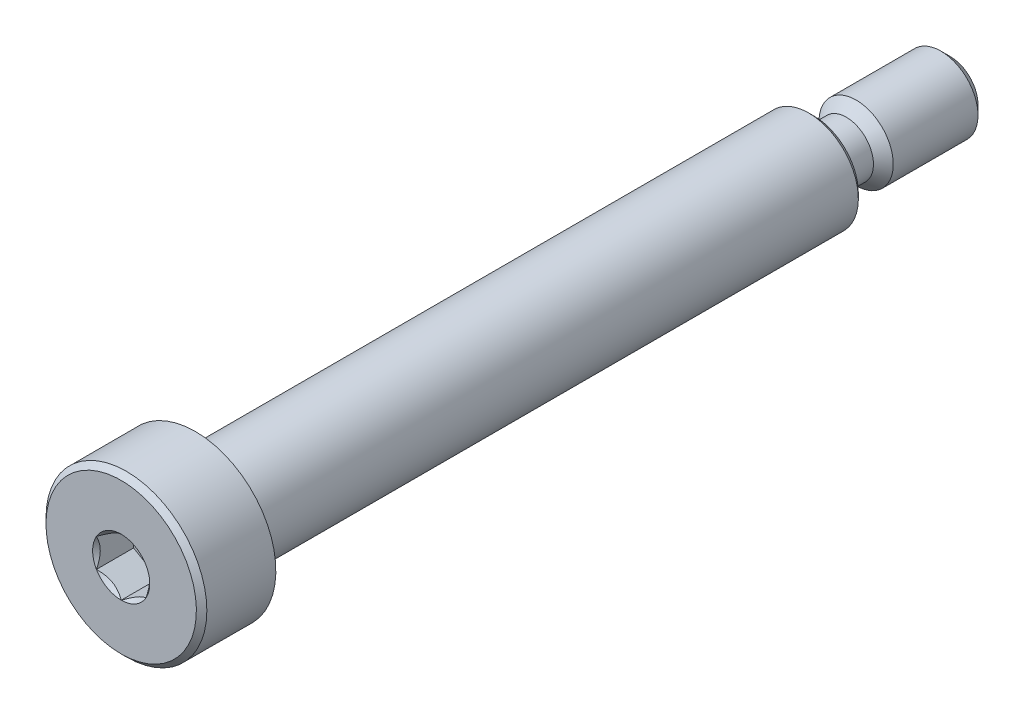
ISO-10303-21;
HEADER;
FILE_DESCRIPTION(('STEP AP214'),'2;1');
FILE_NAME('part.step','',(''),(''),'','','');
FILE_SCHEMA(('AUTOMOTIVE_DESIGN { 1 0 10303 214 1 1 1 1 }'));
ENDSEC;
DATA;
#1=APPLICATION_CONTEXT('core data for automotive mechanical design processes');
#2=APPLICATION_PROTOCOL_DEFINITION('international standard','automotive_design',2000,#1);
#3=PRODUCT_CONTEXT('',#1,'mechanical');
#4=PRODUCT('Part','Part','',(#3));
#5=PRODUCT_RELATED_PRODUCT_CATEGORY('part','',(#4));
#6=PRODUCT_DEFINITION_FORMATION('','',#4);
#7=PRODUCT_DEFINITION_CONTEXT('part definition',#1,'design');
#8=PRODUCT_DEFINITION('design','',#6,#7);
#9=PRODUCT_DEFINITION_SHAPE('','',#8);
#10=(LENGTH_UNIT() NAMED_UNIT(*) SI_UNIT(.MILLI.,.METRE.));
#11=(NAMED_UNIT(*) PLANE_ANGLE_UNIT() SI_UNIT($,.RADIAN.));
#12=(NAMED_UNIT(*) SI_UNIT($,.STERADIAN.) SOLID_ANGLE_UNIT());
#13=UNCERTAINTY_MEASURE_WITH_UNIT(LENGTH_MEASURE(1.E-05),#10,'distance_accuracy_value','');
#14=(GEOMETRIC_REPRESENTATION_CONTEXT(3) GLOBAL_UNCERTAINTY_ASSIGNED_CONTEXT((#13)) GLOBAL_UNIT_ASSIGNED_CONTEXT((#10,
#11,#12)) REPRESENTATION_CONTEXT('',''));
#15=CARTESIAN_POINT('',(0.,0.,0.));
#16=DIRECTION('',(0.,0.,1.));
#17=DIRECTION('',(1.,0.,0.));
#18=AXIS2_PLACEMENT_3D('',#15,#16,#17);
#19=CARTESIAN_POINT('',(0.,0.,-67.));
#20=DIRECTION('',(0.,0.,-1.));
#21=DIRECTION('',(0.,1.,0.));
#22=AXIS2_PLACEMENT_3D('',#19,#20,#21);
#23=CYLINDRICAL_SURFACE('',#22,4.);
#24=CARTESIAN_POINT('',(0.,0.,-55.5775));
#25=DIRECTION('',(0.,0.,-1.));
#26=DIRECTION('',(0.,1.,0.));
#27=AXIS2_PLACEMENT_3D('',#24,#25,#26);
#28=CIRCLE('',#27,4.);
#29=CARTESIAN_POINT('',(0.,4.,-55.5775));
#30=VERTEX_POINT('',#29);
#31=EDGE_CURVE('E257',#30,#30,#28,.F.);
#32=ORIENTED_EDGE('',*,*,#31,.T.);
#33=EDGE_LOOP('',(#32));
#34=FACE_BOUND('',#33,.T.);
#35=CARTESIAN_POINT('',(0.,0.,-7.12666666666668));
#36=DIRECTION('',(0.,0.,-1.));
#37=DIRECTION('',(0.,1.,0.));
#38=AXIS2_PLACEMENT_3D('',#35,#36,#37);
#39=CIRCLE('',#38,4.);
#40=CARTESIAN_POINT('',(0.,4.,-7.12666666666668));
#41=VERTEX_POINT('',#40);
#42=EDGE_CURVE('E285',#41,#41,#39,.T.);
#43=ORIENTED_EDGE('',*,*,#42,.T.);
#44=EDGE_LOOP('',(#43));
#45=FACE_BOUND('',#44,.T.);
#46=ADVANCED_FACE('F41',(#34,#45),#23,.T.);
#47=CARTESIAN_POINT('',(0.,-4.,-56.));
#48=DIRECTION('',(0.,0.,-1.));
#49=DIRECTION('',(0.,1.,0.));
#50=AXIS2_PLACEMENT_3D('',#47,#48,#49);
#51=PLANE('',#50);
#52=CARTESIAN_POINT('',(0.,0.,-56.));
#53=DIRECTION('',(0.,0.,-1.));
#54=DIRECTION('',(0.,1.,0.));
#55=AXIS2_PLACEMENT_3D('',#52,#53,#54);
#56=CIRCLE('',#55,3.5775);
#57=CARTESIAN_POINT('',(0.,3.5775,-56.));
#58=VERTEX_POINT('',#57);
#59=EDGE_CURVE('E260',#58,#58,#56,.T.);
#60=ORIENTED_EDGE('',*,*,#59,.T.);
#61=EDGE_LOOP('',(#60));
#62=FACE_BOUND('',#61,.T.);
#63=CARTESIAN_POINT('',(0.,0.,-56.));
#64=DIRECTION('',(0.,0.,-1.));
#65=DIRECTION('',(0.,1.,0.));
#66=AXIS2_PLACEMENT_3D('',#63,#64,#65);
#67=CIRCLE('',#66,3.00000000000002);
#68=CARTESIAN_POINT('',(0.,3.00000000000002,-56.));
#69=VERTEX_POINT('',#68);
#70=EDGE_CURVE('E311',#69,#69,#67,.T.);
#71=ORIENTED_EDGE('',*,*,#70,.F.);
#72=EDGE_LOOP('',(#71));
#73=FACE_BOUND('',#72,.T.);
#74=ADVANCED_FACE('F211',(#62,#73),#51,.T.);
#75=CARTESIAN_POINT('',(0.,0.,-67.));
#76=DIRECTION('',(0.,0.,-1.));
#77=DIRECTION('',(0.,1.,0.));
#78=AXIS2_PLACEMENT_3D('',#75,#76,#77);
#79=CYLINDRICAL_SURFACE('',#78,3.13333333333333);
#80=CARTESIAN_POINT('',(0.,0.,-6.60666666666667));
#81=DIRECTION('',(0.,0.,-1.));
#82=DIRECTION('',(0.,1.,0.));
#83=AXIS2_PLACEMENT_3D('',#80,#81,#82);
#84=CIRCLE('',#83,3.13333333333333);
#85=CARTESIAN_POINT('',(0.,3.13333333333333,-6.60666666666667));
#86=VERTEX_POINT('',#85);
#87=EDGE_CURVE('E305',#86,#86,#84,.F.);
#88=ORIENTED_EDGE('',*,*,#87,.T.);
#89=EDGE_LOOP('',(#88));
#90=FACE_BOUND('',#89,.T.);
#91=CARTESIAN_POINT('',(0.,0.,-6.));
#92=DIRECTION('',(0.,0.,-1.));
#93=DIRECTION('',(0.,1.,0.));
#94=AXIS2_PLACEMENT_3D('',#91,#92,#93);
#95=CIRCLE('',#94,3.13333333333333);
#96=CARTESIAN_POINT('',(0.,3.13333333333333,-6.));
#97=VERTEX_POINT('',#96);
#98=EDGE_CURVE('E286',#97,#97,#95,.T.);
#99=ORIENTED_EDGE('',*,*,#98,.T.);
#100=EDGE_LOOP('',(#99));
#101=FACE_BOUND('',#100,.T.);
#102=ADVANCED_FACE('F217',(#90,#101),#79,.T.);
#103=CARTESIAN_POINT('',(0.,4.,-6.86666666666667));
#104=DIRECTION('',(0.,0.,-1.));
#105=DIRECTION('',(0.,1.,0.));
#106=AXIS2_PLACEMENT_3D('',#103,#104,#105);
#107=PLANE('',#106);
#108=CARTESIAN_POINT('',(0.,0.,-6.86666666666667));
#109=DIRECTION('',(0.,0.,-1.));
#110=DIRECTION('',(0.,1.,0.));
#111=AXIS2_PLACEMENT_3D('',#108,#109,#110);
#112=CIRCLE('',#111,3.73999999999998);
#113=CARTESIAN_POINT('',(0.,3.73999999999998,-6.86666666666667));
#114=VERTEX_POINT('',#113);
#115=EDGE_CURVE('E301',#114,#114,#112,.F.);
#116=ORIENTED_EDGE('',*,*,#115,.T.);
#117=EDGE_LOOP('',(#116));
#118=FACE_BOUND('',#117,.T.);
#119=CARTESIAN_POINT('',(0.,0.,-6.86666666666667));
#120=DIRECTION('',(0.,0.,-1.));
#121=DIRECTION('',(0.,1.,0.));
#122=AXIS2_PLACEMENT_3D('',#119,#120,#121);
#123=CIRCLE('',#122,3.39333333333333);
#124=CARTESIAN_POINT('',(0.,3.39333333333333,-6.86666666666667));
#125=VERTEX_POINT('',#124);
#126=EDGE_CURVE('E291',#125,#125,#123,.T.);
#127=ORIENTED_EDGE('',*,*,#126,.T.);
#128=EDGE_LOOP('',(#127));
#129=FACE_BOUND('',#128,.T.);
#130=ADVANCED_FACE('F235',(#118,#129),#107,.F.);
#131=CARTESIAN_POINT('',(0.,0.,0.));
#132=DIRECTION('',(0.,0.,1.));
#133=DIRECTION('',(0.,-1.,0.));
#134=AXIS2_PLACEMENT_3D('',#131,#132,#133);
#135=PLANE('',#134);
#136=CARTESIAN_POINT('',(0.,0.,0.));
#137=DIRECTION('',(0.,0.,1.));
#138=DIRECTION('',(1.,0.,0.));
#139=AXIS2_PLACEMENT_3D('',#136,#137,#138);
#140=CIRCLE('',#139,2.3094010767585);
#141=CARTESIAN_POINT('',(0.,-2.3094010767585,0.));
#142=VERTEX_POINT('',#141);
#143=CARTESIAN_POINT('',(2.,-1.15470053837925,0.));
#144=VERTEX_POINT('',#143);
#145=EDGE_CURVE('E62',#142,#144,#140,.T.);
#146=ORIENTED_EDGE('',*,*,#145,.F.);
#147=CARTESIAN_POINT('',(-2.,-1.15470053837925,0.));
#148=VERTEX_POINT('',#147);
#149=EDGE_CURVE('E69',#148,#142,#140,.T.);
#150=ORIENTED_EDGE('',*,*,#149,.F.);
#151=CARTESIAN_POINT('',(-2.,1.15470053837925,0.));
#152=VERTEX_POINT('',#151);
#153=EDGE_CURVE('E149',#152,#148,#140,.T.);
#154=ORIENTED_EDGE('',*,*,#153,.F.);
#155=CARTESIAN_POINT('',(0.,2.3094010767585,0.));
#156=VERTEX_POINT('',#155);
#157=EDGE_CURVE('E141',#156,#152,#140,.T.);
#158=ORIENTED_EDGE('',*,*,#157,.F.);
#159=CARTESIAN_POINT('',(2.,1.15470053837925,0.));
#160=VERTEX_POINT('',#159);
#161=EDGE_CURVE('E111',#160,#156,#140,.T.);
#162=ORIENTED_EDGE('',*,*,#161,.F.);
#163=EDGE_CURVE('E101',#144,#160,#140,.T.);
#164=ORIENTED_EDGE('',*,*,#163,.F.);
#165=EDGE_LOOP('',(#146,#150,#154,#158,#162,#164));
#166=FACE_BOUND('',#165,.T.);
#167=CARTESIAN_POINT('',(0.,0.,0.));
#168=DIRECTION('',(0.,0.,1.));
#169=DIRECTION('',(0.,-1.,0.));
#170=AXIS2_PLACEMENT_3D('',#167,#168,#169);
#171=CIRCLE('',#170,6.07749999999999);
#172=CARTESIAN_POINT('',(0.,-6.07749999999999,0.));
#173=VERTEX_POINT('',#172);
#174=EDGE_CURVE('E56',#173,#173,#171,.T.);
#175=ORIENTED_EDGE('',*,*,#174,.T.);
#176=EDGE_LOOP('',(#175));
#177=FACE_BOUND('',#176,.T.);
#178=ADVANCED_FACE('F138',(#166,#177),#135,.T.);
#179=CARTESIAN_POINT('',(0.,0.,-67.));
#180=DIRECTION('',(0.,0.,-1.));
#181=DIRECTION('',(0.,1.,0.));
#182=AXIS2_PLACEMENT_3D('',#179,#180,#181);
#183=CYLINDRICAL_SURFACE('',#182,6.49999999999999);
#184=CARTESIAN_POINT('',(0.,0.,-0.422499999999992));
#185=DIRECTION('',(0.,0.,1.));
#186=DIRECTION('',(0.,-1.,0.));
#187=AXIS2_PLACEMENT_3D('',#184,#185,#186);
#188=CIRCLE('',#187,6.49999999999999);
#189=CARTESIAN_POINT('',(0.,-6.49999999999999,-0.422499999999992));
#190=VERTEX_POINT('',#189);
#191=EDGE_CURVE('E266',#190,#190,#188,.F.);
#192=ORIENTED_EDGE('',*,*,#191,.T.);
#193=EDGE_LOOP('',(#192));
#194=FACE_BOUND('',#193,.T.);
#195=CARTESIAN_POINT('',(0.,0.,-6.));
#196=DIRECTION('',(0.,0.,-1.));
#197=DIRECTION('',(0.,1.,0.));
#198=AXIS2_PLACEMENT_3D('',#195,#196,#197);
#199=CIRCLE('',#198,6.49999999999999);
#200=CARTESIAN_POINT('',(0.,6.49999999999999,-6.));
#201=VERTEX_POINT('',#200);
#202=EDGE_CURVE('E283',#201,#201,#199,.T.);
#203=ORIENTED_EDGE('',*,*,#202,.F.);
#204=EDGE_LOOP('',(#203));
#205=FACE_BOUND('',#204,.T.);
#206=ADVANCED_FACE('F228',(#194,#205),#183,.T.);
#207=CARTESIAN_POINT('',(0.,-6.49999999999999,-6.));
#208=DIRECTION('',(0.,0.,-1.));
#209=DIRECTION('',(0.,1.,0.));
#210=AXIS2_PLACEMENT_3D('',#207,#208,#209);
#211=PLANE('',#210);
#212=ORIENTED_EDGE('',*,*,#202,.T.);
#213=EDGE_LOOP('',(#212));
#214=FACE_BOUND('',#213,.T.);
#215=ORIENTED_EDGE('',*,*,#98,.F.);
#216=EDGE_LOOP('',(#215));
#217=FACE_BOUND('',#216,.T.);
#218=ADVANCED_FACE('F224',(#214,#217),#211,.T.);
#219=CARTESIAN_POINT('',(0.,0.,-7.12666666666668));
#220=DIRECTION('',(0.,0.,-1.));
#221=DIRECTION('',(0.,1.,0.));
#222=AXIS2_PLACEMENT_3D('',#219,#220,#221);
#223=CONICAL_SURFACE('',#222,4.,0.78539816339745);
#224=ORIENTED_EDGE('',*,*,#115,.F.);
#225=EDGE_LOOP('',(#224));
#226=FACE_BOUND('',#225,.T.);
#227=ORIENTED_EDGE('',*,*,#42,.F.);
#228=EDGE_LOOP('',(#227));
#229=FACE_BOUND('',#228,.T.);
#230=ADVANCED_FACE('F227',(#226,#229),#223,.T.);
#231=CARTESIAN_POINT('',(0.,0.,-6.86666666666667));
#232=DIRECTION('',(0.,0.,-1.));
#233=DIRECTION('',(0.,1.,0.));
#234=AXIS2_PLACEMENT_3D('',#231,#232,#233);
#235=CONICAL_SURFACE('',#234,3.39333333333333,0.785398163397455);
#236=ORIENTED_EDGE('',*,*,#87,.F.);
#237=EDGE_LOOP('',(#236));
#238=FACE_BOUND('',#237,.T.);
#239=ORIENTED_EDGE('',*,*,#126,.F.);
#240=EDGE_LOOP('',(#239));
#241=FACE_BOUND('',#240,.T.);
#242=ADVANCED_FACE('F238',(#238,#241),#235,.T.);
#243=CARTESIAN_POINT('',(0.,0.,-56.8));
#244=DIRECTION('',(0.,0.,-1.));
#245=DIRECTION('',(0.,1.,0.));
#246=AXIS2_PLACEMENT_3D('',#243,#244,#245);
#247=TOROIDAL_SURFACE('',#246,3.00000000000002,0.800000000000018);
#248=CARTESIAN_POINT('',(0.,0.,-56.8));
#249=DIRECTION('',(0.,0.,-1.));
#250=DIRECTION('',(0.,1.,0.));
#251=AXIS2_PLACEMENT_3D('',#248,#249,#250);
#252=CIRCLE('',#251,2.2);
#253=CARTESIAN_POINT('',(0.,2.2,-56.8));
#254=VERTEX_POINT('',#253);
#255=EDGE_CURVE('E389',#254,#254,#252,.T.);
#256=ORIENTED_EDGE('',*,*,#255,.F.);
#257=EDGE_LOOP('',(#256));
#258=FACE_BOUND('',#257,.T.);
#259=ORIENTED_EDGE('',*,*,#70,.T.);
#260=EDGE_LOOP('',(#259));
#261=FACE_BOUND('',#260,.T.);
#262=ADVANCED_FACE('F242',(#258,#261),#247,.F.);
#263=CARTESIAN_POINT('',(0.,0.,-67.));
#264=DIRECTION('',(0.,0.,-1.));
#265=DIRECTION('',(0.,1.,0.));
#266=AXIS2_PLACEMENT_3D('',#263,#264,#265);
#267=CYLINDRICAL_SURFACE('',#266,2.2);
#268=CARTESIAN_POINT('',(0.,0.,-58.6));
#269=DIRECTION('',(0.,0.,-1.));
#270=DIRECTION('',(0.,1.,0.));
#271=AXIS2_PLACEMENT_3D('',#268,#269,#270);
#272=CIRCLE('',#271,2.2);
#273=CARTESIAN_POINT('',(0.,2.2,-58.6));
#274=VERTEX_POINT('',#273);
#275=EDGE_CURVE('E373',#274,#274,#272,.T.);
#276=ORIENTED_EDGE('',*,*,#275,.F.);
#277=EDGE_LOOP('',(#276));
#278=FACE_BOUND('',#277,.T.);
#279=ORIENTED_EDGE('',*,*,#255,.T.);
#280=EDGE_LOOP('',(#279));
#281=FACE_BOUND('',#280,.T.);
#282=ADVANCED_FACE('F326',(#278,#281),#267,.T.);
#283=CARTESIAN_POINT('',(0.,0.,-58.6));
#284=DIRECTION('',(0.,0.,-1.));
#285=DIRECTION('',(0.,1.,0.));
#286=AXIS2_PLACEMENT_3D('',#283,#284,#285);
#287=CONICAL_SURFACE('',#286,2.2,0.785398163397442);
#288=CARTESIAN_POINT('',(0.,0.,-59.4));
#289=DIRECTION('',(0.,0.,-1.));
#290=DIRECTION('',(0.,1.,0.));
#291=AXIS2_PLACEMENT_3D('',#288,#289,#290);
#292=CIRCLE('',#291,3.00000000000002);
#293=CARTESIAN_POINT('',(0.,3.00000000000002,-59.4));
#294=VERTEX_POINT('',#293);
#295=EDGE_CURVE('E294',#294,#294,#292,.F.);
#296=ORIENTED_EDGE('',*,*,#295,.T.);
#297=EDGE_LOOP('',(#296));
#298=FACE_BOUND('',#297,.T.);
#299=ORIENTED_EDGE('',*,*,#275,.T.);
#300=EDGE_LOOP('',(#299));
#301=FACE_BOUND('',#300,.T.);
#302=ADVANCED_FACE('F319',(#298,#301),#287,.T.);
#303=CARTESIAN_POINT('',(0.,-3.00000000000002,-67.));
#304=DIRECTION('',(0.,0.,-1.));
#305=DIRECTION('',(0.,1.,0.));
#306=AXIS2_PLACEMENT_3D('',#303,#304,#305);
#307=PLANE('',#306);
#308=CARTESIAN_POINT('',(0.,0.,-67.));
#309=DIRECTION('',(0.,0.,-1.));
#310=DIRECTION('',(0.,1.,0.));
#311=AXIS2_PLACEMENT_3D('',#308,#309,#310);
#312=CIRCLE('',#311,2.25000000000004);
#313=CARTESIAN_POINT('',(0.,2.25000000000004,-67.));
#314=VERTEX_POINT('',#313);
#315=EDGE_CURVE('E269',#314,#314,#312,.T.);
#316=ORIENTED_EDGE('',*,*,#315,.T.);
#317=EDGE_LOOP('',(#316));
#318=FACE_BOUND('',#317,.T.);
#319=ADVANCED_FACE('F316',(#318),#307,.T.);
#320=CARTESIAN_POINT('',(0.,0.,-67.));
#321=DIRECTION('',(0.,0.,-1.));
#322=DIRECTION('',(0.,1.,0.));
#323=AXIS2_PLACEMENT_3D('',#320,#321,#322);
#324=CYLINDRICAL_SURFACE('',#323,3.00000000000002);
#325=CARTESIAN_POINT('',(0.,0.,-66.25));
#326=DIRECTION('',(0.,0.,-1.));
#327=DIRECTION('',(0.,1.,0.));
#328=AXIS2_PLACEMENT_3D('',#325,#326,#327);
#329=CIRCLE('',#328,3.00000000000002);
#330=CARTESIAN_POINT('',(0.,3.00000000000002,-66.25));
#331=VERTEX_POINT('',#330);
#332=EDGE_CURVE('E262',#331,#331,#329,.F.);
#333=ORIENTED_EDGE('',*,*,#332,.T.);
#334=EDGE_LOOP('',(#333));
#335=FACE_BOUND('',#334,.T.);
#336=ORIENTED_EDGE('',*,*,#295,.F.);
#337=EDGE_LOOP('',(#336));
#338=FACE_BOUND('',#337,.T.);
#339=ADVANCED_FACE('F247',(#335,#338),#324,.T.);
#340=CARTESIAN_POINT('',(0.,0.,-67.));
#341=DIRECTION('',(0.,0.,1.));
#342=DIRECTION('',(0.,-1.,0.));
#343=AXIS2_PLACEMENT_3D('',#340,#341,#342);
#344=CONICAL_SURFACE('',#343,2.25000000000004,0.785398163397445);
#345=ORIENTED_EDGE('',*,*,#332,.F.);
#346=EDGE_LOOP('',(#345));
#347=FACE_BOUND('',#346,.T.);
#348=ORIENTED_EDGE('',*,*,#315,.F.);
#349=EDGE_LOOP('',(#348));
#350=FACE_BOUND('',#349,.T.);
#351=ADVANCED_FACE('F244',(#347,#350),#344,.T.);
#352=CARTESIAN_POINT('',(0.,0.,-56.));
#353=DIRECTION('',(0.,0.,1.));
#354=DIRECTION('',(0.,-1.,0.));
#355=AXIS2_PLACEMENT_3D('',#352,#353,#354);
#356=CONICAL_SURFACE('',#355,3.5775,0.785398163397449);
#357=ORIENTED_EDGE('',*,*,#31,.F.);
#358=EDGE_LOOP('',(#357));
#359=FACE_BOUND('',#358,.T.);
#360=ORIENTED_EDGE('',*,*,#59,.F.);
#361=EDGE_LOOP('',(#360));
#362=FACE_BOUND('',#361,.T.);
#363=ADVANCED_FACE('F246',(#359,#362),#356,.T.);
#364=CARTESIAN_POINT('',(0.,0.,-0.422499999999992));
#365=DIRECTION('',(0.,0.,-1.));
#366=DIRECTION('',(0.,1.,0.));
#367=AXIS2_PLACEMENT_3D('',#364,#365,#366);
#368=CONICAL_SURFACE('',#367,6.49999999999999,0.785398163397458);
#369=ORIENTED_EDGE('',*,*,#174,.F.);
#370=EDGE_LOOP('',(#369));
#371=FACE_BOUND('',#370,.T.);
#372=ORIENTED_EDGE('',*,*,#191,.F.);
#373=EDGE_LOOP('',(#372));
#374=FACE_BOUND('',#373,.T.);
#375=ADVANCED_FACE('F43',(#371,#374),#368,.T.);
#376=CARTESIAN_POINT('',(0.,0.,0.));
#377=DIRECTION('',(0.,0.,1.));
#378=DIRECTION('',(1.,0.,0.));
#379=AXIS2_PLACEMENT_3D('',#376,#377,#378);
#380=CONICAL_SURFACE('',#379,2.3094010767585,0.78539816339745);
#381=ORIENTED_EDGE('',*,*,#161,.T.);
#382=CARTESIAN_POINT('',(2.0002,1.15458506832541,0.000115478713659639));
#383=CARTESIAN_POINT('',(1.93144696596929,1.19427965103065,-0.0395469097744077));
#384=CARTESIAN_POINT('',(1.86154425786449,1.23463799837204,-0.076880017715838));
#385=CARTESIAN_POINT('',(1.71900475544956,1.31693321846145,-0.145236314863857));
#386=CARTESIAN_POINT('',(1.64635440243464,1.35887791933134,-0.176221466262779));
#387=CARTESIAN_POINT('',(1.49985839894603,1.44345742638069,-0.229299783455857));
#388=CARTESIAN_POINT('',(1.42605006475371,1.48607068799507,-0.251526372823389));
#389=CARTESIAN_POINT('',(1.27680836816474,1.57223542169503,-0.285771183324919));
#390=CARTESIAN_POINT('',(1.20137956608185,1.61578426088223,-0.297814970855865));
#391=CARTESIAN_POINT('',(1.07138449932892,1.69083694766536,-0.308681488094428));
#392=CARTESIAN_POINT('',(1.01698621602989,1.72224381117151,-0.31029024639003));
#393=CARTESIAN_POINT('',(0.908278544480307,1.78500621460364,-0.307581122401289));
#394=CARTESIAN_POINT('',(0.853969194078661,1.81636173267754,-0.303261162242026));
#395=CARTESIAN_POINT('',(0.745863272410662,1.87877671565355,-0.288940432590094));
#396=CARTESIAN_POINT('',(0.692067343445208,1.90983580972306,-0.278933307237994));
#397=CARTESIAN_POINT('',(0.585405737694427,1.97141691651548,-0.253787569750341));
#398=CARTESIAN_POINT('',(0.532539989929288,2.00193897021859,-0.23864935095776));
#399=CARTESIAN_POINT('',(0.397120266910156,2.08012358375727,-0.19370549657081));
#400=CARTESIAN_POINT('',(0.315406165150522,2.12730124240478,-0.160511160574184));
#401=CARTESIAN_POINT('',(0.195252962742198,2.19667172615922,-0.10447417682863));
#402=CARTESIAN_POINT('',(0.155657147890823,2.21953238052245,-0.0847852970530601));
#403=CARTESIAN_POINT('',(0.0771990411121281,2.26483018959124,-0.0436126816351289));
#404=CARTESIAN_POINT('',(0.0383363164062602,2.28726759416161,-0.0221300483487535));
#405=CARTESIAN_POINT('',(-0.000199999999999342,2.30951654681234,0.000115478713659038));
#406=B_SPLINE_CURVE_WITH_KNOTS('',3,(#382,#383,#384,#385,#386,#387,#388,#389,#390,#391,#392,
#393,#394,#395,#396,#397,#398,#399,#400,#401,#402,#403,#404,#405),.UNSPECIFIED.,.F.,.F.,(4,2,2,
2,2,2,2,2,2,2,2,4),(0.,0.266420613771064,0.534393751523388,0.798110374376914,1.06116288956936,
1.24939906803722,1.43770123566247,1.62621426093932,1.81471283831913,2.11415604834145,
2.2634717071779,2.41269626969771),.UNSPECIFIED.);
#407=EDGE_CURVE('E11',#160,#156,#406,.T.);
#408=ORIENTED_EDGE('',*,*,#407,.F.);
#409=EDGE_LOOP('',(#381,#408));
#410=FACE_BOUND('',#409,.T.);
#411=ADVANCED_FACE('F114',(#410),#380,.F.);
#412=ORIENTED_EDGE('',*,*,#157,.T.);
#413=CARTESIAN_POINT('',(0.000200000000000682,2.30951654681234,0.000115478713659074));
#414=CARTESIAN_POINT('',(-0.0685530340307048,2.26982196410711,-0.0395469097744083));
#415=CARTESIAN_POINT('',(-0.138455742135511,2.22946361676572,-0.0768800177158386));
#416=CARTESIAN_POINT('',(-0.280995244550436,2.1471683966763,-0.145236314863857));
#417=CARTESIAN_POINT('',(-0.353645597565358,2.10522369580642,-0.17622146626278));
#418=CARTESIAN_POINT('',(-0.500141601053971,2.02064418875706,-0.229299783455858));
#419=CARTESIAN_POINT('',(-0.573949935246294,1.97803092714269,-0.25152637282339));
#420=CARTESIAN_POINT('',(-0.723191631835264,1.89186619344273,-0.28577118332492));
#421=CARTESIAN_POINT('',(-0.798620433918152,1.84831735425552,-0.297814970855866));
#422=CARTESIAN_POINT('',(-0.928615500671079,1.7732646674724,-0.308681488094429));
#423=CARTESIAN_POINT('',(-0.983013783970109,1.74185780396625,-0.31029024639003));
#424=CARTESIAN_POINT('',(-1.09172145551969,1.67909540053412,-0.307581122401289));
#425=CARTESIAN_POINT('',(-1.14603080592134,1.64773988246021,-0.303261162242026));
#426=CARTESIAN_POINT('',(-1.25413672758934,1.5853248994842,-0.288940432590095));
#427=CARTESIAN_POINT('',(-1.30793265655479,1.55426580541469,-0.278933307237994));
#428=CARTESIAN_POINT('',(-1.41459426230557,1.49268469862228,-0.253787569750341));
#429=CARTESIAN_POINT('',(-1.46746001007071,1.46216264491917,-0.238649350957761));
#430=CARTESIAN_POINT('',(-1.60287973308984,1.38397803138049,-0.19370549657081));
#431=CARTESIAN_POINT('',(-1.68459383484948,1.33680037273297,-0.160511160574184));
#432=CARTESIAN_POINT('',(-1.8047470372578,1.26742988897853,-0.104474176828631));
#433=CARTESIAN_POINT('',(-1.84434285210918,1.24456923461531,-0.0847852970530608));
#434=CARTESIAN_POINT('',(-1.92280095888787,1.19927142554652,-0.0436126816351295));
#435=CARTESIAN_POINT('',(-1.96166368359374,1.17683402097614,-0.0221300483487539));
#436=CARTESIAN_POINT('',(-2.0002,1.15458506832541,0.000115478713658824));
#437=B_SPLINE_CURVE_WITH_KNOTS('',3,(#413,#414,#415,#416,#417,#418,#419,#420,#421,#422,#423,
#424,#425,#426,#427,#428,#429,#430,#431,#432,#433,#434,#435,#436),.UNSPECIFIED.,.F.,.F.,(4,2,2,
2,2,2,2,2,2,2,2,4),(0.,0.266420613771063,0.534393751523388,0.798110374376915,1.06116288956936,
1.24939906803722,1.43770123566248,1.62621426093932,1.81471283831913,2.11415604834145,
2.2634717071779,2.41269626969771),.UNSPECIFIED.);
#438=EDGE_CURVE('E143',#156,#152,#437,.T.);
#439=ORIENTED_EDGE('',*,*,#438,.F.);
#440=EDGE_LOOP('',(#412,#439));
#441=FACE_BOUND('',#440,.T.);
#442=ADVANCED_FACE('F417',(#441),#380,.F.);
#443=ORIENTED_EDGE('',*,*,#153,.T.);
#444=CARTESIAN_POINT('',(-2.,-2.30294417292923,0.740771355027721));
#445=CARTESIAN_POINT('',(-2.,-2.24687002663712,0.698443273625964));
#446=CARTESIAN_POINT('',(-2.,-2.19048190536959,0.656525156864338));
#447=CARTESIAN_POINT('',(-2.,-2.07695390496424,0.573690417861017));
#448=CARTESIAN_POINT('',(-2.,-2.01981384066454,0.532774049668074));
#449=CARTESIAN_POINT('',(-2.,-1.90424016804776,0.451833452018563));
#450=CARTESIAN_POINT('',(-2.,-1.8457999674391,0.411818591559868));
#451=CARTESIAN_POINT('',(-2.,-1.7279274546176,0.333288993664294));
#452=CARTESIAN_POINT('',(-2.,-1.66849521292324,0.294774150243142));
#453=CARTESIAN_POINT('',(-2.,-1.4816299571002,0.177640651604295));
#454=CARTESIAN_POINT('',(-2.,-1.35220318163536,0.102145901729644));
#455=CARTESIAN_POINT('',(-2.,-1.08689521592924,-0.035950649005619));
#456=CARTESIAN_POINT('',(-2.,-0.951037763938191,-0.0985959140965044));
#457=CARTESIAN_POINT('',(-2.,-0.747111912259408,-0.175236456124857));
#458=CARTESIAN_POINT('',(-2.,-0.682064034147875,-0.197232820080877));
#459=CARTESIAN_POINT('',(-2.,-0.550398103294751,-0.23600331233986));
#460=CARTESIAN_POINT('',(-2.,-0.483779942722474,-0.252777080878817));
#461=CARTESIAN_POINT('',(-2.,-0.350484328847653,-0.279951742115555));
#462=CARTESIAN_POINT('',(-2.,-0.283829489364785,-0.290461823258314));
#463=CARTESIAN_POINT('',(-2.,-0.149806987139376,-0.304903914455084));
#464=CARTESIAN_POINT('',(-2.,-0.0824394489341211,-0.308837055266886));
#465=CARTESIAN_POINT('',(-2.,0.0499055622944906,-0.309833523066283));
#466=CARTESIAN_POINT('',(-2.,0.114881285143173,-0.307140355149591));
#467=CARTESIAN_POINT('',(-2.,0.244275921482762,-0.295569929577308));
#468=CARTESIAN_POINT('',(-2.,0.308694780266754,-0.286692071166776));
#469=CARTESIAN_POINT('',(-2.,0.437599788610706,-0.263086340703852));
#470=CARTESIAN_POINT('',(-2.,0.502067428644596,-0.248258916553488));
#471=CARTESIAN_POINT('',(-2.,0.629594322598307,-0.21354211637203));
#472=CARTESIAN_POINT('',(-2.,0.692653693883151,-0.193653163893724));
#473=CARTESIAN_POINT('',(-2.,0.891187889210545,-0.123553020743801));
#474=CARTESIAN_POINT('',(-2.,1.02383545707306,-0.065358199678491));
#475=CARTESIAN_POINT('',(-2.,1.28290932150074,0.0640305754595763));
#476=CARTESIAN_POINT('',(-2.,1.4093111258757,0.135271231414841));
#477=CARTESIAN_POINT('',(-2.,1.59200441438963,0.24644199187472));
#478=CARTESIAN_POINT('',(-2.,1.65027549026191,0.283182190337375));
#479=CARTESIAN_POINT('',(-2.,1.76581760389243,0.358214514183766));
#480=CARTESIAN_POINT('',(-2.,1.82308856543105,0.396506757118039));
#481=CARTESIAN_POINT('',(-2.,1.93629654762084,0.474042264081225));
#482=CARTESIAN_POINT('',(-2.,1.99224062500539,0.513275276133585));
#483=CARTESIAN_POINT('',(-2.,2.103364240299,0.592778830736516));
#484=CARTESIAN_POINT('',(-2.,2.15854398422468,0.633049085000597));
#485=CARTESIAN_POINT('',(-2.,2.21340370692659,0.673744238145942));
#486=B_SPLINE_CURVE_WITH_KNOTS('',3,(#444,#445,#446,#447,#448,#449,#450,#451,#452,#453,#454,
#455,#456,#457,#458,#459,#460,#461,#462,#463,#464,#465,#466,#467,#468,#469,#470,#471,#472,#473,
#474,#475,#476,#477,#478,#479,#480,#481,#482,#483,#484,#485),.UNSPECIFIED.,.F.,.F.,(4,2,2,2,2,2,
2,2,2,2,2,2,2,2,2,2,2,2,2,2,4),(0.,0.210772731976891,0.421598374658589,0.634057554623488,
0.84650169587017,1.29562155455624,1.74319622821645,1.94902062110207,2.15485918928326,
2.35699582502635,2.5590977043214,2.75388435553556,2.94868993014815,3.14690093452586,
3.34509535789702,3.77838155837654,4.21325029921625,4.41989056685647,4.62654651460921,
4.8315237711129,5.03644465914085),.UNSPECIFIED.);
#487=EDGE_CURVE('E147',#152,#148,#486,.F.);
#488=ORIENTED_EDGE('',*,*,#487,.F.);
#489=EDGE_LOOP('',(#443,#488));
#490=FACE_BOUND('',#489,.T.);
#491=ADVANCED_FACE('F412',(#490),#380,.F.);
#492=ORIENTED_EDGE('',*,*,#149,.T.);
#493=CARTESIAN_POINT('',(-2.0002,-1.15458506832541,0.000115478713658772));
#494=CARTESIAN_POINT('',(-1.93144696596929,-1.19427965103064,-0.0395469097744086));
#495=CARTESIAN_POINT('',(-1.86154425786449,-1.23463799837204,-0.0768800177158389));
#496=CARTESIAN_POINT('',(-1.71900475544956,-1.31693321846145,-0.145236314863858));
#497=CARTESIAN_POINT('',(-1.64635440243464,-1.35887791933134,-0.17622146626278));
#498=CARTESIAN_POINT('',(-1.49985839894603,-1.44345742638069,-0.229299783455858));
#499=CARTESIAN_POINT('',(-1.42605006475371,-1.48607068799507,-0.25152637282339));
#500=CARTESIAN_POINT('',(-1.27680836816474,-1.57223542169503,-0.28577118332492));
#501=CARTESIAN_POINT('',(-1.20137956608185,-1.61578426088223,-0.297814970855866));
#502=CARTESIAN_POINT('',(-1.07138449932892,-1.69083694766536,-0.308681488094429));
#503=CARTESIAN_POINT('',(-1.01698621602989,-1.72224381117151,-0.31029024639003));
#504=CARTESIAN_POINT('',(-0.908278544480308,-1.78500621460364,-0.307581122401289));
#505=CARTESIAN_POINT('',(-0.853969194078662,-1.81636173267754,-0.303261162242027));
#506=CARTESIAN_POINT('',(-0.745863272410663,-1.87877671565355,-0.288940432590095));
#507=CARTESIAN_POINT('',(-0.692067343445209,-1.90983580972306,-0.278933307237994));
#508=CARTESIAN_POINT('',(-0.585405737694428,-1.97141691651547,-0.253787569750341));
#509=CARTESIAN_POINT('',(-0.532539989929289,-2.00193897021859,-0.238649350957761));
#510=CARTESIAN_POINT('',(-0.397120266910157,-2.08012358375727,-0.193705496570811));
#511=CARTESIAN_POINT('',(-0.315406165150522,-2.12730124240478,-0.160511160574185));
#512=CARTESIAN_POINT('',(-0.195252962742198,-2.19667172615922,-0.104474176828631));
#513=CARTESIAN_POINT('',(-0.155657147890823,-2.21953238052245,-0.0847852970530607));
#514=CARTESIAN_POINT('',(-0.0771990411121283,-2.26483018959124,-0.0436126816351293));
#515=CARTESIAN_POINT('',(-0.0383363164062603,-2.28726759416161,-0.0221300483487537));
#516=CARTESIAN_POINT('',(0.000199999999999315,-2.30951654681234,0.000115478713658909));
#517=B_SPLINE_CURVE_WITH_KNOTS('',3,(#493,#494,#495,#496,#497,#498,#499,#500,#501,#502,#503,
#504,#505,#506,#507,#508,#509,#510,#511,#512,#513,#514,#515,#516),.UNSPECIFIED.,.F.,.F.,(4,2,2,
2,2,2,2,2,2,2,2,4),(0.,0.266420613771063,0.534393751523388,0.798110374376913,1.06116288956936,
1.24939906803722,1.43770123566247,1.62621426093931,1.81471283831913,2.11415604834145,
2.2634717071779,2.41269626969771),.UNSPECIFIED.);
#518=EDGE_CURVE('E175',#148,#142,#517,.T.);
#519=ORIENTED_EDGE('',*,*,#518,.F.);
#520=EDGE_LOOP('',(#492,#519));
#521=FACE_BOUND('',#520,.T.);
#522=ADVANCED_FACE('F416',(#521),#380,.F.);
#523=ORIENTED_EDGE('',*,*,#145,.T.);
#524=CARTESIAN_POINT('',(-0.000200000000000669,-2.30951654681234,0.00011547871365864));
#525=CARTESIAN_POINT('',(0.0685530340307048,-2.26982196410711,-0.0395469097744086));
#526=CARTESIAN_POINT('',(0.138455742135511,-2.22946361676572,-0.0768800177158389));
#527=CARTESIAN_POINT('',(0.280995244550436,-2.1471683966763,-0.145236314863858));
#528=CARTESIAN_POINT('',(0.353645597565358,-2.10522369580642,-0.17622146626278));
#529=CARTESIAN_POINT('',(0.500141601053971,-2.02064418875706,-0.229299783455858));
#530=CARTESIAN_POINT('',(0.573949935246294,-1.97803092714269,-0.25152637282339));
#531=CARTESIAN_POINT('',(0.723191631835264,-1.89186619344273,-0.28577118332492));
#532=CARTESIAN_POINT('',(0.798620433918152,-1.84831735425552,-0.297814970855866));
#533=CARTESIAN_POINT('',(0.928615500671079,-1.7732646674724,-0.308681488094429));
#534=CARTESIAN_POINT('',(0.983013783970109,-1.74185780396625,-0.310290246390031));
#535=CARTESIAN_POINT('',(1.09172145551969,-1.67909540053412,-0.307581122401289));
#536=CARTESIAN_POINT('',(1.14603080592134,-1.64773988246021,-0.303261162242026));
#537=CARTESIAN_POINT('',(1.25413672758934,-1.5853248994842,-0.288940432590095));
#538=CARTESIAN_POINT('',(1.30793265655479,-1.55426580541469,-0.278933307237994));
#539=CARTESIAN_POINT('',(1.41459426230557,-1.49268469862228,-0.253787569750341));
#540=CARTESIAN_POINT('',(1.46746001007071,-1.46216264491917,-0.238649350957761));
#541=CARTESIAN_POINT('',(1.60287973308984,-1.38397803138049,-0.19370549657081));
#542=CARTESIAN_POINT('',(1.68459383484948,-1.33680037273297,-0.160511160574184));
#543=CARTESIAN_POINT('',(1.8047470372578,-1.26742988897853,-0.104474176828631));
#544=CARTESIAN_POINT('',(1.84434285210918,-1.24456923461531,-0.0847852970530604));
#545=CARTESIAN_POINT('',(1.92280095888787,-1.19927142554652,-0.0436126816351291));
#546=CARTESIAN_POINT('',(1.96166368359374,-1.17683402097614,-0.0221300483487535));
#547=CARTESIAN_POINT('',(2.0002,-1.15458506832541,0.000115478713659038));
#548=B_SPLINE_CURVE_WITH_KNOTS('',3,(#524,#525,#526,#527,#528,#529,#530,#531,#532,#533,#534,
#535,#536,#537,#538,#539,#540,#541,#542,#543,#544,#545,#546,#547),.UNSPECIFIED.,.F.,.F.,(4,2,2,
2,2,2,2,2,2,2,2,4),(0.,0.266420613771064,0.534393751523388,0.798110374376914,1.06116288956936,
1.24939906803722,1.43770123566247,1.62621426093932,1.81471283831913,2.11415604834145,
2.2634717071779,2.41269626969771),.UNSPECIFIED.);
#549=EDGE_CURVE('E127',#142,#144,#548,.T.);
#550=ORIENTED_EDGE('',*,*,#549,.F.);
#551=EDGE_LOOP('',(#523,#550));
#552=FACE_BOUND('',#551,.T.);
#553=ADVANCED_FACE('F168',(#552),#380,.F.);
#554=ORIENTED_EDGE('',*,*,#163,.T.);
#555=CARTESIAN_POINT('',(2.,-2.30294417292923,0.740771355027722));
#556=CARTESIAN_POINT('',(2.,-2.24687002663712,0.698443273625964));
#557=CARTESIAN_POINT('',(2.,-2.19048190536959,0.656525156864338));
#558=CARTESIAN_POINT('',(2.,-2.07695390496424,0.573690417861018));
#559=CARTESIAN_POINT('',(2.,-2.01981384066454,0.532774049668074));
#560=CARTESIAN_POINT('',(2.,-1.90424016804776,0.451833452018564));
#561=CARTESIAN_POINT('',(2.,-1.8457999674391,0.411818591559868));
#562=CARTESIAN_POINT('',(2.,-1.7279274546176,0.333288993664294));
#563=CARTESIAN_POINT('',(2.,-1.66849521292324,0.294774150243142));
#564=CARTESIAN_POINT('',(2.,-1.4816299571002,0.177640651604295));
#565=CARTESIAN_POINT('',(2.,-1.35220318163536,0.102145901729644));
#566=CARTESIAN_POINT('',(2.,-1.08689521592925,-0.0359506490056186));
#567=CARTESIAN_POINT('',(2.,-0.951037763938192,-0.0985959140965041));
#568=CARTESIAN_POINT('',(2.,-0.747111912259409,-0.175236456124857));
#569=CARTESIAN_POINT('',(2.,-0.682064034147876,-0.197232820080877));
#570=CARTESIAN_POINT('',(2.,-0.550398103294752,-0.23600331233986));
#571=CARTESIAN_POINT('',(2.,-0.483779942722475,-0.252777080878817));
#572=CARTESIAN_POINT('',(2.,-0.350484328847654,-0.279951742115555));
#573=CARTESIAN_POINT('',(2.,-0.283829489364785,-0.290461823258314));
#574=CARTESIAN_POINT('',(2.,-0.149806987139376,-0.304903914455084));
#575=CARTESIAN_POINT('',(2.,-0.0824394489341213,-0.308837055266886));
#576=CARTESIAN_POINT('',(2.,0.0499055622944904,-0.309833523066283));
#577=CARTESIAN_POINT('',(2.,0.114881285143173,-0.307140355149591));
#578=CARTESIAN_POINT('',(2.,0.244275921482761,-0.295569929577308));
#579=CARTESIAN_POINT('',(2.,0.308694780266754,-0.286692071166776));
#580=CARTESIAN_POINT('',(2.,0.437599788610705,-0.263086340703852));
#581=CARTESIAN_POINT('',(2.,0.502067428644595,-0.248258916553488));
#582=CARTESIAN_POINT('',(2.,0.629594322598306,-0.21354211637203));
#583=CARTESIAN_POINT('',(2.,0.692653693883151,-0.193653163893725));
#584=CARTESIAN_POINT('',(2.,0.891187889210545,-0.123553020743802));
#585=CARTESIAN_POINT('',(2.,1.02383545707306,-0.0653581996784919));
#586=CARTESIAN_POINT('',(2.,1.28290932150074,0.0640305754595757));
#587=CARTESIAN_POINT('',(2.,1.4093111258757,0.135271231414841));
#588=CARTESIAN_POINT('',(2.,1.59200441438963,0.24644199187472));
#589=CARTESIAN_POINT('',(2.,1.65027549026191,0.283182190337374));
#590=CARTESIAN_POINT('',(2.,1.76581760389243,0.358214514183765));
#591=CARTESIAN_POINT('',(2.,1.82308856543105,0.396506757118039));
#592=CARTESIAN_POINT('',(2.,1.93629654762084,0.474042264081225));
#593=CARTESIAN_POINT('',(2.,1.99224062500539,0.513275276133585));
#594=CARTESIAN_POINT('',(2.,2.103364240299,0.592778830736515));
#595=CARTESIAN_POINT('',(2.,2.15854398422468,0.633049085000597));
#596=CARTESIAN_POINT('',(2.,2.21340370692659,0.673744238145941));
#597=B_SPLINE_CURVE_WITH_KNOTS('',3,(#555,#556,#557,#558,#559,#560,#561,#562,#563,#564,#565,
#566,#567,#568,#569,#570,#571,#572,#573,#574,#575,#576,#577,#578,#579,#580,#581,#582,#583,#584,
#585,#586,#587,#588,#589,#590,#591,#592,#593,#594,#595,#596),.UNSPECIFIED.,.F.,.F.,(4,2,2,2,2,2,
2,2,2,2,2,2,2,2,2,2,2,2,2,2,4),(0.,0.210772731976892,0.42159837465859,0.634057554623488,
0.84650169587017,1.29562155455624,1.74319622821645,1.94902062110207,2.15485918928326,
2.35699582502635,2.5590977043214,2.75388435553556,2.94868993014815,3.14690093452586,
3.34509535789702,3.77838155837654,4.21325029921625,4.41989056685647,4.62654651460921,
4.8315237711129,5.03644465914085),.UNSPECIFIED.);
#598=EDGE_CURVE('E105',#144,#160,#597,.T.);
#599=ORIENTED_EDGE('',*,*,#598,.F.);
#600=EDGE_LOOP('',(#554,#599));
#601=FACE_BOUND('',#600,.T.);
#602=ADVANCED_FACE('F103',(#601),#380,.F.);
#603=CARTESIAN_POINT('',(0.,0.,-3.));
#604=DIRECTION('',(0.,0.,1.));
#605=DIRECTION('',(1.,0.,0.));
#606=AXIS2_PLACEMENT_3D('',#603,#604,#605);
#607=PLANE('',#606);
#608=DIRECTION('',(0.,1.,0.));
#609=VECTOR('',#608,1.);
#610=CARTESIAN_POINT('',(2.,-1.15470053837925,-3.));
#611=LINE('',#610,#609);
#612=CARTESIAN_POINT('',(2.,-1.15470053837925,-3.));
#613=VERTEX_POINT('',#612);
#614=CARTESIAN_POINT('',(2.,1.15470053837925,-3.));
#615=VERTEX_POINT('',#614);
#616=EDGE_CURVE('E126',#613,#615,#611,.T.);
#617=ORIENTED_EDGE('',*,*,#616,.T.);
#618=DIRECTION('',(-0.866025403784439,0.5,0.));
#619=VECTOR('',#618,1.);
#620=CARTESIAN_POINT('',(2.,1.15470053837925,-3.));
#621=LINE('',#620,#619);
#622=CARTESIAN_POINT('',(0.,2.3094010767585,-3.));
#623=VERTEX_POINT('',#622);
#624=EDGE_CURVE('E131',#615,#623,#621,.T.);
#625=ORIENTED_EDGE('',*,*,#624,.T.);
#626=DIRECTION('',(-0.866025403784439,-0.5,0.));
#627=VECTOR('',#626,1.);
#628=CARTESIAN_POINT('',(0.,2.3094010767585,-3.));
#629=LINE('',#628,#627);
#630=CARTESIAN_POINT('',(-2.,1.15470053837925,-3.));
#631=VERTEX_POINT('',#630);
#632=EDGE_CURVE('E357',#623,#631,#629,.T.);
#633=ORIENTED_EDGE('',*,*,#632,.T.);
#634=DIRECTION('',(0.,-1.,0.));
#635=VECTOR('',#634,1.);
#636=CARTESIAN_POINT('',(-2.,1.15470053837925,-3.));
#637=LINE('',#636,#635);
#638=CARTESIAN_POINT('',(-2.,-1.15470053837925,-3.));
#639=VERTEX_POINT('',#638);
#640=EDGE_CURVE('E362',#631,#639,#637,.T.);
#641=ORIENTED_EDGE('',*,*,#640,.T.);
#642=DIRECTION('',(0.866025403784438,-0.5,0.));
#643=VECTOR('',#642,1.);
#644=CARTESIAN_POINT('',(-2.,-1.15470053837925,-3.));
#645=LINE('',#644,#643);
#646=CARTESIAN_POINT('',(0.,-2.3094010767585,-3.));
#647=VERTEX_POINT('',#646);
#648=EDGE_CURVE('E366',#639,#647,#645,.T.);
#649=ORIENTED_EDGE('',*,*,#648,.T.);
#650=DIRECTION('',(0.866025403784439,0.5,0.));
#651=VECTOR('',#650,1.);
#652=CARTESIAN_POINT('',(0.,-2.3094010767585,-3.));
#653=LINE('',#652,#651);
#654=EDGE_CURVE('E135',#647,#613,#653,.T.);
#655=ORIENTED_EDGE('',*,*,#654,.T.);
#656=EDGE_LOOP('',(#617,#625,#633,#641,#649,#655));
#657=FACE_BOUND('',#656,.T.);
#658=ADVANCED_FACE('F167',(#657),#607,.T.);
#659=CARTESIAN_POINT('',(2.,1.15470053837925,-3.));
#660=DIRECTION('',(0.5,0.866025403784439,0.));
#661=DIRECTION('',(-0.866025403784439,0.5,0.));
#662=AXIS2_PLACEMENT_3D('',#659,#660,#661);
#663=PLANE('',#662);
#664=DIRECTION('',(0.,0.,1.));
#665=VECTOR('',#664,1.);
#666=CARTESIAN_POINT('',(2.,1.15470053837925,-3.));
#667=LINE('',#666,#665);
#668=EDGE_CURVE('E122',#615,#160,#667,.T.);
#669=ORIENTED_EDGE('',*,*,#668,.T.);
#670=ORIENTED_EDGE('',*,*,#407,.T.);
#671=DIRECTION('',(0.,0.,1.));
#672=VECTOR('',#671,1.);
#673=CARTESIAN_POINT('',(0.,2.3094010767585,-3.));
#674=LINE('',#673,#672);
#675=EDGE_CURVE('E134',#623,#156,#674,.T.);
#676=ORIENTED_EDGE('',*,*,#675,.F.);
#677=ORIENTED_EDGE('',*,*,#624,.F.);
#678=EDGE_LOOP('',(#669,#670,#676,#677));
#679=FACE_BOUND('',#678,.T.);
#680=ADVANCED_FACE('F129',(#679),#663,.F.);
#681=CARTESIAN_POINT('',(0.,2.3094010767585,-3.));
#682=DIRECTION('',(-0.5,0.866025403784439,0.));
#683=DIRECTION('',(-0.866025403784439,-0.5,0.));
#684=AXIS2_PLACEMENT_3D('',#681,#682,#683);
#685=PLANE('',#684);
#686=ORIENTED_EDGE('',*,*,#675,.T.);
#687=ORIENTED_EDGE('',*,*,#438,.T.);
#688=DIRECTION('',(0.,0.,1.));
#689=VECTOR('',#688,1.);
#690=CARTESIAN_POINT('',(-2.,1.15470053837925,-3.));
#691=LINE('',#690,#689);
#692=EDGE_CURVE('E381',#631,#152,#691,.T.);
#693=ORIENTED_EDGE('',*,*,#692,.F.);
#694=ORIENTED_EDGE('',*,*,#632,.F.);
#695=EDGE_LOOP('',(#686,#687,#693,#694));
#696=FACE_BOUND('',#695,.T.);
#697=ADVANCED_FACE('F162',(#696),#685,.F.);
#698=CARTESIAN_POINT('',(-2.,1.15470053837925,-3.));
#699=DIRECTION('',(-1.,0.,0.));
#700=DIRECTION('',(0.,0.,1.));
#701=AXIS2_PLACEMENT_3D('',#698,#699,#700);
#702=PLANE('',#701);
#703=ORIENTED_EDGE('',*,*,#692,.T.);
#704=ORIENTED_EDGE('',*,*,#487,.T.);
#705=DIRECTION('',(0.,0.,1.));
#706=VECTOR('',#705,1.);
#707=CARTESIAN_POINT('',(-2.,-1.15470053837925,-3.));
#708=LINE('',#707,#706);
#709=EDGE_CURVE('E378',#639,#148,#708,.T.);
#710=ORIENTED_EDGE('',*,*,#709,.F.);
#711=ORIENTED_EDGE('',*,*,#640,.F.);
#712=EDGE_LOOP('',(#703,#704,#710,#711));
#713=FACE_BOUND('',#712,.T.);
#714=ADVANCED_FACE('F200',(#713),#702,.F.);
#715=CARTESIAN_POINT('',(-2.,-1.15470053837925,-3.));
#716=DIRECTION('',(-0.5,-0.866025403784439,0.));
#717=DIRECTION('',(0.866025403784439,-0.5,0.));
#718=AXIS2_PLACEMENT_3D('',#715,#716,#717);
#719=PLANE('',#718);
#720=ORIENTED_EDGE('',*,*,#709,.T.);
#721=ORIENTED_EDGE('',*,*,#518,.T.);
#722=DIRECTION('',(0.,0.,1.));
#723=VECTOR('',#722,1.);
#724=CARTESIAN_POINT('',(0.,-2.3094010767585,-3.));
#725=LINE('',#724,#723);
#726=EDGE_CURVE('E374',#647,#142,#725,.T.);
#727=ORIENTED_EDGE('',*,*,#726,.F.);
#728=ORIENTED_EDGE('',*,*,#648,.F.);
#729=EDGE_LOOP('',(#720,#721,#727,#728));
#730=FACE_BOUND('',#729,.T.);
#731=ADVANCED_FACE('F196',(#730),#719,.F.);
#732=CARTESIAN_POINT('',(0.,-2.3094010767585,-3.));
#733=DIRECTION('',(0.5,-0.866025403784439,0.));
#734=DIRECTION('',(0.866025403784439,0.5,0.));
#735=AXIS2_PLACEMENT_3D('',#732,#733,#734);
#736=PLANE('',#735);
#737=ORIENTED_EDGE('',*,*,#726,.T.);
#738=ORIENTED_EDGE('',*,*,#549,.T.);
#739=DIRECTION('',(0.,0.,1.));
#740=VECTOR('',#739,1.);
#741=CARTESIAN_POINT('',(2.,-1.15470053837925,-3.));
#742=LINE('',#741,#740);
#743=EDGE_CURVE('E124',#613,#144,#742,.T.);
#744=ORIENTED_EDGE('',*,*,#743,.F.);
#745=ORIENTED_EDGE('',*,*,#654,.F.);
#746=EDGE_LOOP('',(#737,#738,#744,#745));
#747=FACE_BOUND('',#746,.T.);
#748=ADVANCED_FACE('F193',(#747),#736,.F.);
#749=CARTESIAN_POINT('',(2.,-1.15470053837925,-3.));
#750=DIRECTION('',(1.,0.,0.));
#751=DIRECTION('',(0.,0.,-1.));
#752=AXIS2_PLACEMENT_3D('',#749,#750,#751);
#753=PLANE('',#752);
#754=ORIENTED_EDGE('',*,*,#743,.T.);
#755=ORIENTED_EDGE('',*,*,#598,.T.);
#756=ORIENTED_EDGE('',*,*,#668,.F.);
#757=ORIENTED_EDGE('',*,*,#616,.F.);
#758=EDGE_LOOP('',(#754,#755,#756,#757));
#759=FACE_BOUND('',#758,.T.);
#760=ADVANCED_FACE('F120',(#759),#753,.F.);
#761=CLOSED_SHELL('',(#46,#74,#102,#130,#178,#206,#218,#230,#242,#262,#282,#302,#319,#339,#351,
#363,#375,#411,#442,#491,#522,#553,#602,#658,#680,#697,#714,#731,#748,#760));
#762=MANIFOLD_SOLID_BREP('B2',#761);
#763=ADVANCED_BREP_SHAPE_REPRESENTATION('',(#18,#762),#14);
#764=SHAPE_DEFINITION_REPRESENTATION(#9,#763);
ENDSEC;
END-ISO-10303-21;
